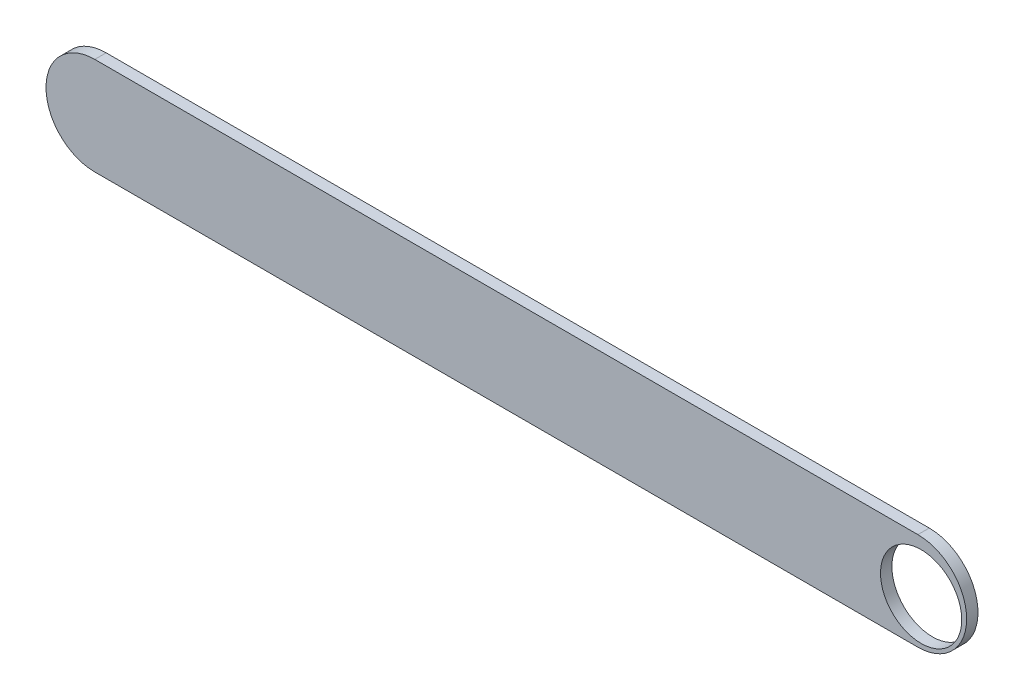
ISO-10303-21;
HEADER;
FILE_DESCRIPTION(('STEP AP214'),'2;1');
FILE_NAME('part.step','',(''),(''),'','','');
FILE_SCHEMA(('AUTOMOTIVE_DESIGN { 1 0 10303 214 1 1 1 1 }'));
ENDSEC;
DATA;
#1=APPLICATION_CONTEXT('core data for automotive mechanical design processes');
#2=APPLICATION_PROTOCOL_DEFINITION('international standard','automotive_design',2000,#1);
#3=PRODUCT_CONTEXT('',#1,'mechanical');
#4=PRODUCT('Part','Part','',(#3));
#5=PRODUCT_RELATED_PRODUCT_CATEGORY('part','',(#4));
#6=PRODUCT_DEFINITION_FORMATION('','',#4);
#7=PRODUCT_DEFINITION_CONTEXT('part definition',#1,'design');
#8=PRODUCT_DEFINITION('design','',#6,#7);
#9=PRODUCT_DEFINITION_SHAPE('','',#8);
#10=(LENGTH_UNIT() NAMED_UNIT(*) SI_UNIT(.MILLI.,.METRE.));
#11=(NAMED_UNIT(*) PLANE_ANGLE_UNIT() SI_UNIT($,.RADIAN.));
#12=(NAMED_UNIT(*) SI_UNIT($,.STERADIAN.) SOLID_ANGLE_UNIT());
#13=UNCERTAINTY_MEASURE_WITH_UNIT(LENGTH_MEASURE(1.E-05),#10,'distance_accuracy_value','');
#14=(GEOMETRIC_REPRESENTATION_CONTEXT(3) GLOBAL_UNCERTAINTY_ASSIGNED_CONTEXT((#13)) GLOBAL_UNIT_ASSIGNED_CONTEXT((#10,
#11,#12)) REPRESENTATION_CONTEXT('',''));
#15=CARTESIAN_POINT('',(0.,0.,0.));
#16=DIRECTION('',(0.,0.,1.));
#17=DIRECTION('',(1.,0.,0.));
#18=AXIS2_PLACEMENT_3D('',#15,#16,#17);
#19=CARTESIAN_POINT('',(125.63,-68.51,-0.045));
#20=DIRECTION('',(0.,0.,-1.));
#21=DIRECTION('',(0.,-1.,0.));
#22=AXIS2_PLACEMENT_3D('',#19,#20,#21);
#23=CYLINDRICAL_SURFACE('',#22,0.125);
#24=CARTESIAN_POINT('',(125.63,-68.51,1.6));
#25=DIRECTION('',(0.,0.,-1.));
#26=DIRECTION('',(0.,-1.,0.));
#27=AXIS2_PLACEMENT_3D('',#24,#25,#26);
#28=CIRCLE('',#27,0.125);
#29=CARTESIAN_POINT('',(125.63,-68.635,1.6));
#30=VERTEX_POINT('',#29);
#31=EDGE_CURVE('E20',#30,#30,#28,.T.);
#32=ORIENTED_EDGE('',*,*,#31,.T.);
#33=DIRECTION('',(0.,0.,1.));
#34=VECTOR('',#33,1.);
#35=CARTESIAN_POINT('',(125.63,-68.635,-0.045));
#36=LINE('',#35,#34);
#37=CARTESIAN_POINT('',(125.63,-68.635,1.635));
#38=VERTEX_POINT('',#37);
#39=EDGE_CURVE('E11',#30,#38,#36,.T.);
#40=ORIENTED_EDGE('',*,*,#39,.T.);
#41=CARTESIAN_POINT('',(125.63,-68.51,1.635));
#42=DIRECTION('',(0.,0.,-1.));
#43=DIRECTION('',(0.,-1.,0.));
#44=AXIS2_PLACEMENT_3D('',#41,#42,#43);
#45=CIRCLE('',#44,0.125);
#46=EDGE_CURVE('E27',#38,#38,#45,.T.);
#47=ORIENTED_EDGE('',*,*,#46,.F.);
#48=ORIENTED_EDGE('',*,*,#39,.F.);
#49=EDGE_LOOP('',(#32,#40,#47,#48));
#50=FACE_BOUND('',#49,.T.);
#51=ADVANCED_FACE('F17',(#50),#23,.F.);
#52=CARTESIAN_POINT('',(125.62,-68.35,1.6));
#53=DIRECTION('',(0.,-1.,0.));
#54=DIRECTION('',(0.,0.,-1.));
#55=AXIS2_PLACEMENT_3D('',#52,#53,#54);
#56=PLANE('',#55);
#57=DIRECTION('',(-1.,0.,0.));
#58=VECTOR('',#57,1.);
#59=CARTESIAN_POINT('',(125.62,-68.35,1.6));
#60=LINE('',#59,#58);
#61=CARTESIAN_POINT('',(125.62,-68.35,1.6));
#62=VERTEX_POINT('',#61);
#63=CARTESIAN_POINT('',(123.0875,-68.35,1.6));
#64=VERTEX_POINT('',#63);
#65=EDGE_CURVE('E122',#62,#64,#60,.T.);
#66=ORIENTED_EDGE('',*,*,#65,.T.);
#67=DIRECTION('',(0.,0.,1.));
#68=VECTOR('',#67,1.);
#69=CARTESIAN_POINT('',(123.0875,-68.35,1.6));
#70=LINE('',#69,#68);
#71=CARTESIAN_POINT('',(123.0875,-68.35,1.635));
#72=VERTEX_POINT('',#71);
#73=EDGE_CURVE('E83',#64,#72,#70,.T.);
#74=ORIENTED_EDGE('',*,*,#73,.T.);
#75=DIRECTION('',(-1.,0.,0.));
#76=VECTOR('',#75,1.);
#77=CARTESIAN_POINT('',(125.62,-68.35,1.635));
#78=LINE('',#77,#76);
#79=CARTESIAN_POINT('',(125.62,-68.35,1.635));
#80=VERTEX_POINT('',#79);
#81=EDGE_CURVE('E114',#80,#72,#78,.T.);
#82=ORIENTED_EDGE('',*,*,#81,.F.);
#83=DIRECTION('',(0.,0.,1.));
#84=VECTOR('',#83,1.);
#85=CARTESIAN_POINT('',(125.62,-68.35,1.6));
#86=LINE('',#85,#84);
#87=EDGE_CURVE('E115',#62,#80,#86,.T.);
#88=ORIENTED_EDGE('',*,*,#87,.F.);
#89=EDGE_LOOP('',(#66,#74,#82,#88));
#90=FACE_BOUND('',#89,.T.);
#91=ADVANCED_FACE('F140',(#90),#56,.F.);
#92=CARTESIAN_POINT('',(123.0875,-68.65,1.635));
#93=DIRECTION('',(0.,0.,1.));
#94=DIRECTION('',(1.,0.,0.));
#95=AXIS2_PLACEMENT_3D('',#92,#93,#94);
#96=PLANE('',#95);
#97=ORIENTED_EDGE('',*,*,#46,.T.);
#98=EDGE_LOOP('',(#97));
#99=FACE_BOUND('',#98,.T.);
#100=DIRECTION('',(1.,0.,0.));
#101=VECTOR('',#100,1.);
#102=CARTESIAN_POINT('',(123.0875,-68.65,1.635));
#103=LINE('',#102,#101);
#104=CARTESIAN_POINT('',(123.0875,-68.65,1.635));
#105=VERTEX_POINT('',#104);
#106=CARTESIAN_POINT('',(125.62,-68.65,1.635));
#107=VERTEX_POINT('',#106);
#108=EDGE_CURVE('E95',#105,#107,#103,.T.);
#109=ORIENTED_EDGE('',*,*,#108,.T.);
#110=CARTESIAN_POINT('',(125.62,-68.5,1.635));
#111=DIRECTION('',(0.,0.,1.));
#112=DIRECTION('',(0.,-1.,0.));
#113=AXIS2_PLACEMENT_3D('',#110,#111,#112);
#114=CIRCLE('',#113,0.15);
#115=EDGE_CURVE('E118',#107,#80,#114,.T.);
#116=ORIENTED_EDGE('',*,*,#115,.T.);
#117=ORIENTED_EDGE('',*,*,#81,.T.);
#118=CARTESIAN_POINT('',(123.0875,-68.5,1.635));
#119=DIRECTION('',(0.,0.,1.));
#120=DIRECTION('',(0.,1.,0.));
#121=AXIS2_PLACEMENT_3D('',#118,#119,#120);
#122=CIRCLE('',#121,0.15);
#123=EDGE_CURVE('E87',#72,#105,#122,.T.);
#124=ORIENTED_EDGE('',*,*,#123,.T.);
#125=EDGE_LOOP('',(#109,#116,#117,#124));
#126=FACE_BOUND('',#125,.T.);
#127=ADVANCED_FACE('F135',(#99,#126),#96,.T.);
#128=CARTESIAN_POINT('',(123.0875,-68.65,1.6));
#129=DIRECTION('',(0.,0.,1.));
#130=DIRECTION('',(1.,0.,0.));
#131=AXIS2_PLACEMENT_3D('',#128,#129,#130);
#132=PLANE('',#131);
#133=ORIENTED_EDGE('',*,*,#31,.F.);
#134=EDGE_LOOP('',(#133));
#135=FACE_BOUND('',#134,.T.);
#136=CARTESIAN_POINT('',(123.0875,-68.5,1.6));
#137=DIRECTION('',(0.,0.,1.));
#138=DIRECTION('',(0.,1.,0.));
#139=AXIS2_PLACEMENT_3D('',#136,#137,#138);
#140=CIRCLE('',#139,0.15);
#141=CARTESIAN_POINT('',(123.0875,-68.65,1.6));
#142=VERTEX_POINT('',#141);
#143=EDGE_CURVE('E76',#64,#142,#140,.T.);
#144=ORIENTED_EDGE('',*,*,#143,.F.);
#145=ORIENTED_EDGE('',*,*,#65,.F.);
#146=CARTESIAN_POINT('',(125.62,-68.5,1.6));
#147=DIRECTION('',(0.,0.,1.));
#148=DIRECTION('',(0.,-1.,0.));
#149=AXIS2_PLACEMENT_3D('',#146,#147,#148);
#150=CIRCLE('',#149,0.15);
#151=CARTESIAN_POINT('',(125.62,-68.65,1.6));
#152=VERTEX_POINT('',#151);
#153=EDGE_CURVE('E100',#152,#62,#150,.T.);
#154=ORIENTED_EDGE('',*,*,#153,.F.);
#155=DIRECTION('',(1.,0.,0.));
#156=VECTOR('',#155,1.);
#157=CARTESIAN_POINT('',(123.0875,-68.65,1.6));
#158=LINE('',#157,#156);
#159=EDGE_CURVE('E93',#142,#152,#158,.T.);
#160=ORIENTED_EDGE('',*,*,#159,.F.);
#161=EDGE_LOOP('',(#144,#145,#154,#160));
#162=FACE_BOUND('',#161,.T.);
#163=ADVANCED_FACE('F98',(#135,#162),#132,.F.);
#164=CARTESIAN_POINT('',(125.62,-68.5,1.6));
#165=DIRECTION('',(0.,0.,-1.));
#166=DIRECTION('',(0.,-1.,0.));
#167=AXIS2_PLACEMENT_3D('',#164,#165,#166);
#168=CYLINDRICAL_SURFACE('',#167,0.15);
#169=ORIENTED_EDGE('',*,*,#153,.T.);
#170=ORIENTED_EDGE('',*,*,#87,.T.);
#171=ORIENTED_EDGE('',*,*,#115,.F.);
#172=DIRECTION('',(0.,0.,1.));
#173=VECTOR('',#172,1.);
#174=CARTESIAN_POINT('',(125.62,-68.65,1.6));
#175=LINE('',#174,#173);
#176=EDGE_CURVE('E103',#152,#107,#175,.T.);
#177=ORIENTED_EDGE('',*,*,#176,.F.);
#178=EDGE_LOOP('',(#169,#170,#171,#177));
#179=FACE_BOUND('',#178,.T.);
#180=ADVANCED_FACE('F138',(#179),#168,.T.);
#181=CARTESIAN_POINT('',(123.0875,-68.5,1.6));
#182=DIRECTION('',(0.,0.,-1.));
#183=DIRECTION('',(0.,1.,0.));
#184=AXIS2_PLACEMENT_3D('',#181,#182,#183);
#185=CYLINDRICAL_SURFACE('',#184,0.15);
#186=ORIENTED_EDGE('',*,*,#143,.T.);
#187=DIRECTION('',(0.,0.,1.));
#188=VECTOR('',#187,1.);
#189=CARTESIAN_POINT('',(123.0875,-68.65,1.6));
#190=LINE('',#189,#188);
#191=EDGE_CURVE('E80',#142,#105,#190,.T.);
#192=ORIENTED_EDGE('',*,*,#191,.T.);
#193=ORIENTED_EDGE('',*,*,#123,.F.);
#194=ORIENTED_EDGE('',*,*,#73,.F.);
#195=EDGE_LOOP('',(#186,#192,#193,#194));
#196=FACE_BOUND('',#195,.T.);
#197=ADVANCED_FACE('F78',(#196),#185,.T.);
#198=CARTESIAN_POINT('',(123.0875,-68.65,1.6));
#199=DIRECTION('',(0.,1.,0.));
#200=DIRECTION('',(1.,0.,0.));
#201=AXIS2_PLACEMENT_3D('',#198,#199,#200);
#202=PLANE('',#201);
#203=ORIENTED_EDGE('',*,*,#159,.T.);
#204=ORIENTED_EDGE('',*,*,#176,.T.);
#205=ORIENTED_EDGE('',*,*,#108,.F.);
#206=ORIENTED_EDGE('',*,*,#191,.F.);
#207=EDGE_LOOP('',(#203,#204,#205,#206));
#208=FACE_BOUND('',#207,.T.);
#209=ADVANCED_FACE('F91',(#208),#202,.F.);
#210=CLOSED_SHELL('',(#51,#91,#127,#163,#180,#197,#209));
#211=MANIFOLD_SOLID_BREP('B1',#210);
#212=ADVANCED_BREP_SHAPE_REPRESENTATION('',(#18,#211),#14);
#213=SHAPE_DEFINITION_REPRESENTATION(#9,#212);
ENDSEC;
END-ISO-10303-21;
